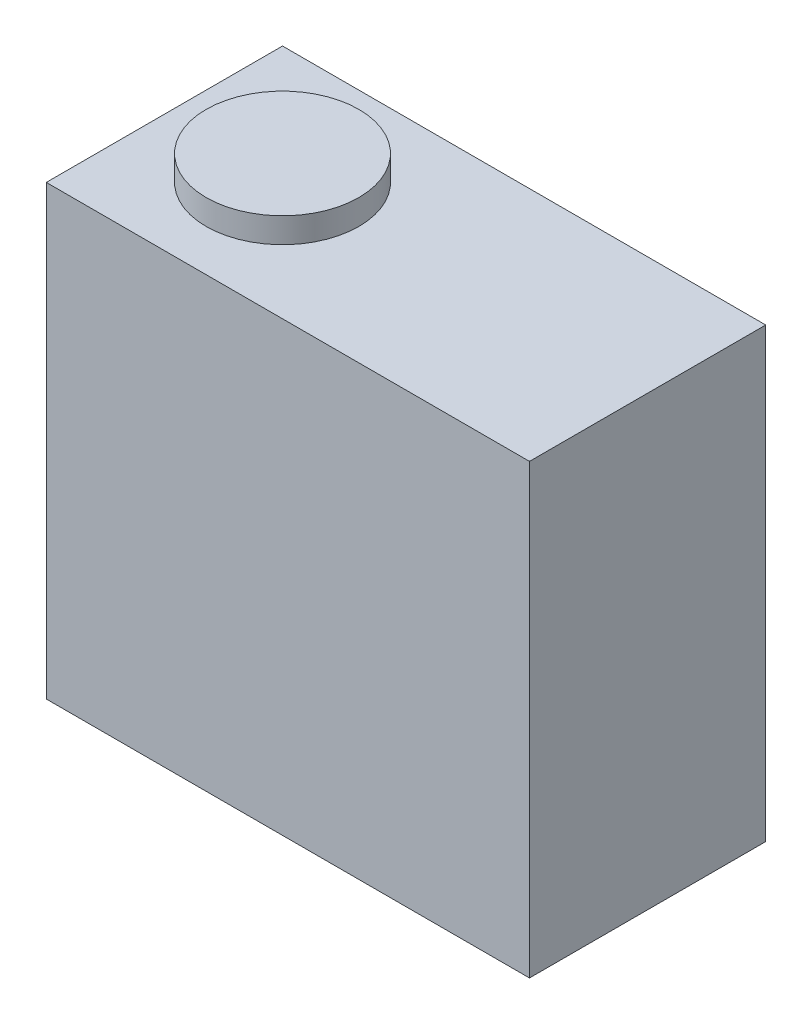
ISO-10303-21;
HEADER;
FILE_DESCRIPTION(('STEP AP214'),'2;1');
FILE_NAME('part.step','',(''),(''),'','','');
FILE_SCHEMA(('AUTOMOTIVE_DESIGN { 1 0 10303 214 1 1 1 1 }'));
ENDSEC;
DATA;
#1=APPLICATION_CONTEXT('core data for automotive mechanical design processes');
#2=APPLICATION_PROTOCOL_DEFINITION('international standard','automotive_design',2000,#1);
#3=PRODUCT_CONTEXT('',#1,'mechanical');
#4=PRODUCT('Part','Part','',(#3));
#5=PRODUCT_RELATED_PRODUCT_CATEGORY('part','',(#4));
#6=PRODUCT_DEFINITION_FORMATION('','',#4);
#7=PRODUCT_DEFINITION_CONTEXT('part definition',#1,'design');
#8=PRODUCT_DEFINITION('design','',#6,#7);
#9=PRODUCT_DEFINITION_SHAPE('','',#8);
#10=(LENGTH_UNIT() NAMED_UNIT(*) SI_UNIT(.MILLI.,.METRE.));
#11=(NAMED_UNIT(*) PLANE_ANGLE_UNIT() SI_UNIT($,.RADIAN.));
#12=(NAMED_UNIT(*) SI_UNIT($,.STERADIAN.) SOLID_ANGLE_UNIT());
#13=UNCERTAINTY_MEASURE_WITH_UNIT(LENGTH_MEASURE(1.E-05),#10,'distance_accuracy_value','');
#14=(GEOMETRIC_REPRESENTATION_CONTEXT(3) GLOBAL_UNCERTAINTY_ASSIGNED_CONTEXT((#13)) GLOBAL_UNIT_ASSIGNED_CONTEXT((#10,
#11,#12)) REPRESENTATION_CONTEXT('',''));
#15=CARTESIAN_POINT('',(0.,0.,0.));
#16=DIRECTION('',(0.,0.,1.));
#17=DIRECTION('',(1.,0.,0.));
#18=AXIS2_PLACEMENT_3D('',#15,#16,#17);
#19=CARTESIAN_POINT('',(0.,2.1,0.));
#20=DIRECTION('',(0.,-1.,0.));
#21=DIRECTION('',(0.,0.,-1.));
#22=AXIS2_PLACEMENT_3D('',#19,#20,#21);
#23=CYLINDRICAL_SURFACE('',#22,6.4);
#24=CARTESIAN_POINT('',(0.,2.1,0.));
#25=DIRECTION('',(0.,1.,0.));
#26=DIRECTION('',(0.,0.,1.));
#27=AXIS2_PLACEMENT_3D('',#24,#25,#26);
#28=CIRCLE('',#27,6.4);
#29=CARTESIAN_POINT('',(0.,2.1,6.4));
#30=VERTEX_POINT('',#29);
#31=EDGE_CURVE('E11',#30,#30,#28,.T.);
#32=ORIENTED_EDGE('',*,*,#31,.F.);
#33=EDGE_LOOP('',(#32));
#34=FACE_BOUND('',#33,.T.);
#35=CARTESIAN_POINT('',(0.,0.,0.));
#36=DIRECTION('',(0.,-1.,0.));
#37=DIRECTION('',(0.,0.,-1.));
#38=AXIS2_PLACEMENT_3D('',#35,#36,#37);
#39=CIRCLE('',#38,6.4);
#40=CARTESIAN_POINT('',(0.,0.,-6.4));
#41=VERTEX_POINT('',#40);
#42=EDGE_CURVE('E40',#41,#41,#39,.T.);
#43=ORIENTED_EDGE('',*,*,#42,.F.);
#44=EDGE_LOOP('',(#43));
#45=FACE_BOUND('',#44,.T.);
#46=ADVANCED_FACE('F32',(#34,#45),#23,.T.);
#47=CARTESIAN_POINT('',(0.,2.1,0.));
#48=DIRECTION('',(0.,1.,0.));
#49=DIRECTION('',(0.,0.,1.));
#50=AXIS2_PLACEMENT_3D('',#47,#48,#49);
#51=PLANE('',#50);
#52=ORIENTED_EDGE('',*,*,#31,.T.);
#53=EDGE_LOOP('',(#52));
#54=FACE_BOUND('',#53,.T.);
#55=ADVANCED_FACE('F113',(#54),#51,.T.);
#56=CARTESIAN_POINT('',(0.,0.,0.));
#57=DIRECTION('',(0.,-1.,0.));
#58=DIRECTION('',(0.,0.,-1.));
#59=AXIS2_PLACEMENT_3D('',#56,#57,#58);
#60=PLANE('',#59);
#61=DIRECTION('',(0.,0.,-1.));
#62=VECTOR('',#61,1.);
#63=CARTESIAN_POINT('',(-9.9,0.,9.9));
#64=LINE('',#63,#62);
#65=CARTESIAN_POINT('',(-9.9,0.,9.9));
#66=VERTEX_POINT('',#65);
#67=CARTESIAN_POINT('',(-9.9,0.,-9.9));
#68=VERTEX_POINT('',#67);
#69=EDGE_CURVE('E99',#66,#68,#64,.T.);
#70=ORIENTED_EDGE('',*,*,#69,.F.);
#71=DIRECTION('',(-1.,0.,0.));
#72=VECTOR('',#71,1.);
#73=CARTESIAN_POINT('',(-9.9,0.,9.9));
#74=LINE('',#73,#72);
#75=CARTESIAN_POINT('',(30.6,0.,9.9));
#76=VERTEX_POINT('',#75);
#77=EDGE_CURVE('E71',#76,#66,#74,.T.);
#78=ORIENTED_EDGE('',*,*,#77,.F.);
#79=DIRECTION('',(0.,0.,1.));
#80=VECTOR('',#79,1.);
#81=CARTESIAN_POINT('',(30.6,0.,9.9));
#82=LINE('',#81,#80);
#83=CARTESIAN_POINT('',(30.6,0.,-9.9));
#84=VERTEX_POINT('',#83);
#85=EDGE_CURVE('E65',#84,#76,#82,.T.);
#86=ORIENTED_EDGE('',*,*,#85,.F.);
#87=DIRECTION('',(1.,0.,0.));
#88=VECTOR('',#87,1.);
#89=CARTESIAN_POINT('',(-9.9,0.,-9.9));
#90=LINE('',#89,#88);
#91=EDGE_CURVE('E89',#68,#84,#90,.T.);
#92=ORIENTED_EDGE('',*,*,#91,.F.);
#93=EDGE_LOOP('',(#70,#78,#86,#92));
#94=FACE_BOUND('',#93,.T.);
#95=ORIENTED_EDGE('',*,*,#42,.T.);
#96=EDGE_LOOP('',(#95));
#97=FACE_BOUND('',#96,.T.);
#98=ADVANCED_FACE('F110',(#94,#97),#60,.F.);
#99=CARTESIAN_POINT('',(-9.9,-37.5,9.9));
#100=DIRECTION('',(1.,0.,0.));
#101=DIRECTION('',(0.,0.,-1.));
#102=AXIS2_PLACEMENT_3D('',#99,#100,#101);
#103=PLANE('',#102);
#104=ORIENTED_EDGE('',*,*,#69,.T.);
#105=DIRECTION('',(0.,1.,0.));
#106=VECTOR('',#105,1.);
#107=CARTESIAN_POINT('',(-9.9,-37.5,-9.9));
#108=LINE('',#107,#106);
#109=CARTESIAN_POINT('',(-9.9,-37.5,-9.9));
#110=VERTEX_POINT('',#109);
#111=EDGE_CURVE('E90',#110,#68,#108,.T.);
#112=ORIENTED_EDGE('',*,*,#111,.F.);
#113=DIRECTION('',(0.,0.,-1.));
#114=VECTOR('',#113,1.);
#115=CARTESIAN_POINT('',(-9.9,-37.5,9.9));
#116=LINE('',#115,#114);
#117=CARTESIAN_POINT('',(-9.9,-37.5,9.9));
#118=VERTEX_POINT('',#117);
#119=EDGE_CURVE('E84',#118,#110,#116,.T.);
#120=ORIENTED_EDGE('',*,*,#119,.F.);
#121=DIRECTION('',(0.,1.,0.));
#122=VECTOR('',#121,1.);
#123=CARTESIAN_POINT('',(-9.9,-37.5,9.9));
#124=LINE('',#123,#122);
#125=EDGE_CURVE('E95',#118,#66,#124,.T.);
#126=ORIENTED_EDGE('',*,*,#125,.T.);
#127=EDGE_LOOP('',(#104,#112,#120,#126));
#128=FACE_BOUND('',#127,.T.);
#129=ADVANCED_FACE('F123',(#128),#103,.F.);
#130=CARTESIAN_POINT('',(-9.9,-37.5,-9.9));
#131=DIRECTION('',(0.,0.,1.));
#132=DIRECTION('',(1.,0.,0.));
#133=AXIS2_PLACEMENT_3D('',#130,#131,#132);
#134=PLANE('',#133);
#135=ORIENTED_EDGE('',*,*,#91,.T.);
#136=DIRECTION('',(0.,1.,0.));
#137=VECTOR('',#136,1.);
#138=CARTESIAN_POINT('',(30.6,-37.5,-9.9));
#139=LINE('',#138,#137);
#140=CARTESIAN_POINT('',(30.6,-37.5,-9.9));
#141=VERTEX_POINT('',#140);
#142=EDGE_CURVE('E87',#141,#84,#139,.T.);
#143=ORIENTED_EDGE('',*,*,#142,.F.);
#144=DIRECTION('',(1.,0.,0.));
#145=VECTOR('',#144,1.);
#146=CARTESIAN_POINT('',(-9.9,-37.5,-9.9));
#147=LINE('',#146,#145);
#148=EDGE_CURVE('E79',#110,#141,#147,.T.);
#149=ORIENTED_EDGE('',*,*,#148,.F.);
#150=ORIENTED_EDGE('',*,*,#111,.T.);
#151=EDGE_LOOP('',(#135,#143,#149,#150));
#152=FACE_BOUND('',#151,.T.);
#153=ADVANCED_FACE('F88',(#152),#134,.F.);
#154=CARTESIAN_POINT('',(30.6,-37.5,9.9));
#155=DIRECTION('',(-1.,0.,0.));
#156=DIRECTION('',(0.,0.,1.));
#157=AXIS2_PLACEMENT_3D('',#154,#155,#156);
#158=PLANE('',#157);
#159=ORIENTED_EDGE('',*,*,#85,.T.);
#160=DIRECTION('',(0.,1.,0.));
#161=VECTOR('',#160,1.);
#162=CARTESIAN_POINT('',(30.6,-37.5,9.9));
#163=LINE('',#162,#161);
#164=CARTESIAN_POINT('',(30.6,-37.5,9.9));
#165=VERTEX_POINT('',#164);
#166=EDGE_CURVE('E91',#165,#76,#163,.T.);
#167=ORIENTED_EDGE('',*,*,#166,.F.);
#168=DIRECTION('',(0.,0.,1.));
#169=VECTOR('',#168,1.);
#170=CARTESIAN_POINT('',(30.6,-37.5,9.9));
#171=LINE('',#170,#169);
#172=EDGE_CURVE('E82',#141,#165,#171,.T.);
#173=ORIENTED_EDGE('',*,*,#172,.F.);
#174=ORIENTED_EDGE('',*,*,#142,.T.);
#175=EDGE_LOOP('',(#159,#167,#173,#174));
#176=FACE_BOUND('',#175,.T.);
#177=ADVANCED_FACE('F93',(#176),#158,.F.);
#178=CARTESIAN_POINT('',(-9.9,-37.5,9.9));
#179=DIRECTION('',(0.,0.,-1.));
#180=DIRECTION('',(-1.,0.,0.));
#181=AXIS2_PLACEMENT_3D('',#178,#179,#180);
#182=PLANE('',#181);
#183=ORIENTED_EDGE('',*,*,#77,.T.);
#184=ORIENTED_EDGE('',*,*,#125,.F.);
#185=DIRECTION('',(-1.,0.,0.));
#186=VECTOR('',#185,1.);
#187=CARTESIAN_POINT('',(-9.9,-37.5,9.9));
#188=LINE('',#187,#186);
#189=EDGE_CURVE('E48',#165,#118,#188,.T.);
#190=ORIENTED_EDGE('',*,*,#189,.F.);
#191=ORIENTED_EDGE('',*,*,#166,.T.);
#192=EDGE_LOOP('',(#183,#184,#190,#191));
#193=FACE_BOUND('',#192,.T.);
#194=ADVANCED_FACE('F134',(#193),#182,.F.);
#195=CARTESIAN_POINT('',(0.,-37.5,0.));
#196=DIRECTION('',(0.,-1.,0.));
#197=DIRECTION('',(0.,0.,-1.));
#198=AXIS2_PLACEMENT_3D('',#195,#196,#197);
#199=PLANE('',#198);
#200=ORIENTED_EDGE('',*,*,#119,.T.);
#201=ORIENTED_EDGE('',*,*,#148,.T.);
#202=ORIENTED_EDGE('',*,*,#172,.T.);
#203=ORIENTED_EDGE('',*,*,#189,.T.);
#204=EDGE_LOOP('',(#200,#201,#202,#203));
#205=FACE_BOUND('',#204,.T.);
#206=ADVANCED_FACE('F80',(#205),#199,.T.);
#207=CLOSED_SHELL('',(#46,#55,#98,#129,#153,#177,#194,#206));
#208=MANIFOLD_SOLID_BREP('B2',#207);
#209=ADVANCED_BREP_SHAPE_REPRESENTATION('',(#18,#208),#14);
#210=SHAPE_DEFINITION_REPRESENTATION(#9,#209);
ENDSEC;
END-ISO-10303-21;
